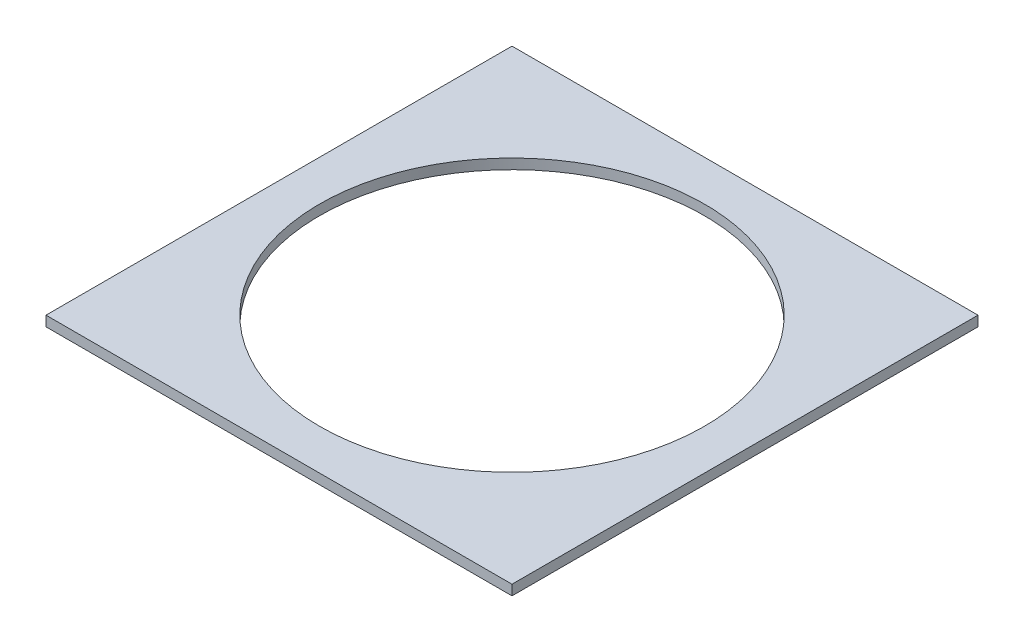
ISO-10303-21;
HEADER;
FILE_DESCRIPTION(('STEP AP214'),'2;1');
FILE_NAME('part.step','',(''),(''),'','','');
FILE_SCHEMA(('AUTOMOTIVE_DESIGN { 1 0 10303 214 1 1 1 1 }'));
ENDSEC;
DATA;
#1=APPLICATION_CONTEXT('core data for automotive mechanical design processes');
#2=APPLICATION_PROTOCOL_DEFINITION('international standard','automotive_design',2000,#1);
#3=PRODUCT_CONTEXT('',#1,'mechanical');
#4=PRODUCT('Part','Part','',(#3));
#5=PRODUCT_RELATED_PRODUCT_CATEGORY('part','',(#4));
#6=PRODUCT_DEFINITION_FORMATION('','',#4);
#7=PRODUCT_DEFINITION_CONTEXT('part definition',#1,'design');
#8=PRODUCT_DEFINITION('design','',#6,#7);
#9=PRODUCT_DEFINITION_SHAPE('','',#8);
#10=(LENGTH_UNIT() NAMED_UNIT(*) SI_UNIT(.MILLI.,.METRE.));
#11=(NAMED_UNIT(*) PLANE_ANGLE_UNIT() SI_UNIT($,.RADIAN.));
#12=(NAMED_UNIT(*) SI_UNIT($,.STERADIAN.) SOLID_ANGLE_UNIT());
#13=UNCERTAINTY_MEASURE_WITH_UNIT(LENGTH_MEASURE(1.E-05),#10,'distance_accuracy_value','');
#14=(GEOMETRIC_REPRESENTATION_CONTEXT(3) GLOBAL_UNCERTAINTY_ASSIGNED_CONTEXT((#13)) GLOBAL_UNIT_ASSIGNED_CONTEXT((#10,
#11,#12)) REPRESENTATION_CONTEXT('',''));
#15=CARTESIAN_POINT('',(0.,0.,0.));
#16=DIRECTION('',(0.,0.,1.));
#17=DIRECTION('',(1.,0.,0.));
#18=AXIS2_PLACEMENT_3D('',#15,#16,#17);
#19=CARTESIAN_POINT('',(-146.05,6.35,-146.05));
#20=DIRECTION('',(1.,0.,0.));
#21=DIRECTION('',(0.,0.,-1.));
#22=AXIS2_PLACEMENT_3D('',#19,#20,#21);
#23=PLANE('',#22);
#24=DIRECTION('',(0.,0.,1.));
#25=VECTOR('',#24,1.);
#26=CARTESIAN_POINT('',(-146.05,0.,-146.05));
#27=LINE('',#26,#25);
#28=CARTESIAN_POINT('',(-146.05,0.,-146.05));
#29=VERTEX_POINT('',#28);
#30=CARTESIAN_POINT('',(-146.05,0.,146.05));
#31=VERTEX_POINT('',#30);
#32=EDGE_CURVE('E111',#29,#31,#27,.T.);
#33=ORIENTED_EDGE('',*,*,#32,.T.);
#34=DIRECTION('',(0.,-1.,0.));
#35=VECTOR('',#34,1.);
#36=CARTESIAN_POINT('',(-146.05,6.35,146.05));
#37=LINE('',#36,#35);
#38=CARTESIAN_POINT('',(-146.05,6.35,146.05));
#39=VERTEX_POINT('',#38);
#40=EDGE_CURVE('E11',#39,#31,#37,.T.);
#41=ORIENTED_EDGE('',*,*,#40,.F.);
#42=DIRECTION('',(0.,0.,1.));
#43=VECTOR('',#42,1.);
#44=CARTESIAN_POINT('',(-146.05,6.35,-146.05));
#45=LINE('',#44,#43);
#46=CARTESIAN_POINT('',(-146.05,6.35,-146.05));
#47=VERTEX_POINT('',#46);
#48=EDGE_CURVE('E95',#47,#39,#45,.T.);
#49=ORIENTED_EDGE('',*,*,#48,.F.);
#50=DIRECTION('',(0.,-1.,0.));
#51=VECTOR('',#50,1.);
#52=CARTESIAN_POINT('',(-146.05,6.35,-146.05));
#53=LINE('',#52,#51);
#54=EDGE_CURVE('E107',#47,#29,#53,.T.);
#55=ORIENTED_EDGE('',*,*,#54,.T.);
#56=EDGE_LOOP('',(#33,#41,#49,#55));
#57=FACE_BOUND('',#56,.T.);
#58=ADVANCED_FACE('F43',(#57),#23,.F.);
#59=CARTESIAN_POINT('',(-146.05,6.35,146.05));
#60=DIRECTION('',(0.,0.,-1.));
#61=DIRECTION('',(-1.,0.,0.));
#62=AXIS2_PLACEMENT_3D('',#59,#60,#61);
#63=PLANE('',#62);
#64=DIRECTION('',(1.,0.,0.));
#65=VECTOR('',#64,1.);
#66=CARTESIAN_POINT('',(-146.05,0.,146.05));
#67=LINE('',#66,#65);
#68=CARTESIAN_POINT('',(146.05,0.,146.05));
#69=VERTEX_POINT('',#68);
#70=EDGE_CURVE('E100',#31,#69,#67,.T.);
#71=ORIENTED_EDGE('',*,*,#70,.T.);
#72=DIRECTION('',(0.,-1.,0.));
#73=VECTOR('',#72,1.);
#74=CARTESIAN_POINT('',(146.05,6.35,146.05));
#75=LINE('',#74,#73);
#76=CARTESIAN_POINT('',(146.05,6.35,146.05));
#77=VERTEX_POINT('',#76);
#78=EDGE_CURVE('E52',#77,#69,#75,.T.);
#79=ORIENTED_EDGE('',*,*,#78,.F.);
#80=DIRECTION('',(1.,0.,0.));
#81=VECTOR('',#80,1.);
#82=CARTESIAN_POINT('',(-146.05,6.35,146.05));
#83=LINE('',#82,#81);
#84=EDGE_CURVE('E90',#39,#77,#83,.T.);
#85=ORIENTED_EDGE('',*,*,#84,.F.);
#86=ORIENTED_EDGE('',*,*,#40,.T.);
#87=EDGE_LOOP('',(#71,#79,#85,#86));
#88=FACE_BOUND('',#87,.T.);
#89=ADVANCED_FACE('F99',(#88),#63,.F.);
#90=CARTESIAN_POINT('',(146.05,6.35,-146.05));
#91=DIRECTION('',(-1.,0.,0.));
#92=DIRECTION('',(0.,0.,1.));
#93=AXIS2_PLACEMENT_3D('',#90,#91,#92);
#94=PLANE('',#93);
#95=DIRECTION('',(0.,0.,-1.));
#96=VECTOR('',#95,1.);
#97=CARTESIAN_POINT('',(146.05,0.,-146.05));
#98=LINE('',#97,#96);
#99=CARTESIAN_POINT('',(146.05,0.,-146.05));
#100=VERTEX_POINT('',#99);
#101=EDGE_CURVE('E77',#69,#100,#98,.T.);
#102=ORIENTED_EDGE('',*,*,#101,.T.);
#103=DIRECTION('',(0.,-1.,0.));
#104=VECTOR('',#103,1.);
#105=CARTESIAN_POINT('',(146.05,6.35,-146.05));
#106=LINE('',#105,#104);
#107=CARTESIAN_POINT('',(146.05,6.35,-146.05));
#108=VERTEX_POINT('',#107);
#109=EDGE_CURVE('E102',#108,#100,#106,.T.);
#110=ORIENTED_EDGE('',*,*,#109,.F.);
#111=DIRECTION('',(0.,0.,-1.));
#112=VECTOR('',#111,1.);
#113=CARTESIAN_POINT('',(146.05,6.35,-146.05));
#114=LINE('',#113,#112);
#115=EDGE_CURVE('E93',#77,#108,#114,.T.);
#116=ORIENTED_EDGE('',*,*,#115,.F.);
#117=ORIENTED_EDGE('',*,*,#78,.T.);
#118=EDGE_LOOP('',(#102,#110,#116,#117));
#119=FACE_BOUND('',#118,.T.);
#120=ADVANCED_FACE('F103',(#119),#94,.F.);
#121=CARTESIAN_POINT('',(-146.05,6.35,-146.05));
#122=DIRECTION('',(0.,0.,1.));
#123=DIRECTION('',(1.,0.,0.));
#124=AXIS2_PLACEMENT_3D('',#121,#122,#123);
#125=PLANE('',#124);
#126=DIRECTION('',(-1.,0.,0.));
#127=VECTOR('',#126,1.);
#128=CARTESIAN_POINT('',(-146.05,0.,-146.05));
#129=LINE('',#128,#127);
#130=EDGE_CURVE('E83',#100,#29,#129,.T.);
#131=ORIENTED_EDGE('',*,*,#130,.T.);
#132=ORIENTED_EDGE('',*,*,#54,.F.);
#133=DIRECTION('',(-1.,0.,0.));
#134=VECTOR('',#133,1.);
#135=CARTESIAN_POINT('',(-146.05,6.35,-146.05));
#136=LINE('',#135,#134);
#137=EDGE_CURVE('E60',#108,#47,#136,.T.);
#138=ORIENTED_EDGE('',*,*,#137,.F.);
#139=ORIENTED_EDGE('',*,*,#109,.T.);
#140=EDGE_LOOP('',(#131,#132,#138,#139));
#141=FACE_BOUND('',#140,.T.);
#142=ADVANCED_FACE('F125',(#141),#125,.F.);
#143=CARTESIAN_POINT('',(0.,6.35,0.));
#144=DIRECTION('',(0.,1.,0.));
#145=DIRECTION('',(0.,0.,1.));
#146=AXIS2_PLACEMENT_3D('',#143,#144,#145);
#147=PLANE('',#146);
#148=CARTESIAN_POINT('',(0.,6.35,0.));
#149=DIRECTION('',(0.,1.,0.));
#150=DIRECTION('',(0.,0.,1.));
#151=AXIS2_PLACEMENT_3D('',#148,#149,#150);
#152=CIRCLE('',#151,120.65);
#153=CARTESIAN_POINT('',(0.,6.35,120.65));
#154=VERTEX_POINT('',#153);
#155=EDGE_CURVE('E132',#154,#154,#152,.T.);
#156=ORIENTED_EDGE('',*,*,#155,.F.);
#157=EDGE_LOOP('',(#156));
#158=FACE_BOUND('',#157,.T.);
#159=ORIENTED_EDGE('',*,*,#48,.T.);
#160=ORIENTED_EDGE('',*,*,#84,.T.);
#161=ORIENTED_EDGE('',*,*,#115,.T.);
#162=ORIENTED_EDGE('',*,*,#137,.T.);
#163=EDGE_LOOP('',(#159,#160,#161,#162));
#164=FACE_BOUND('',#163,.T.);
#165=ADVANCED_FACE('F91',(#158,#164),#147,.T.);
#166=CARTESIAN_POINT('',(0.,0.,0.));
#167=DIRECTION('',(0.,1.,0.));
#168=DIRECTION('',(0.,0.,1.));
#169=AXIS2_PLACEMENT_3D('',#166,#167,#168);
#170=PLANE('',#169);
#171=CARTESIAN_POINT('',(0.,0.,0.));
#172=DIRECTION('',(0.,1.,0.));
#173=DIRECTION('',(0.,0.,1.));
#174=AXIS2_PLACEMENT_3D('',#171,#172,#173);
#175=CIRCLE('',#174,120.65);
#176=CARTESIAN_POINT('',(0.,0.,120.65));
#177=VERTEX_POINT('',#176);
#178=EDGE_CURVE('E115',#177,#177,#175,.T.);
#179=ORIENTED_EDGE('',*,*,#178,.T.);
#180=EDGE_LOOP('',(#179));
#181=FACE_BOUND('',#180,.T.);
#182=ORIENTED_EDGE('',*,*,#32,.F.);
#183=ORIENTED_EDGE('',*,*,#130,.F.);
#184=ORIENTED_EDGE('',*,*,#101,.F.);
#185=ORIENTED_EDGE('',*,*,#70,.F.);
#186=EDGE_LOOP('',(#182,#183,#184,#185));
#187=FACE_BOUND('',#186,.T.);
#188=ADVANCED_FACE('F128',(#181,#187),#170,.F.);
#189=CARTESIAN_POINT('',(0.,0.,0.));
#190=DIRECTION('',(0.,1.,0.));
#191=DIRECTION('',(0.,0.,1.));
#192=AXIS2_PLACEMENT_3D('',#189,#190,#191);
#193=CYLINDRICAL_SURFACE('',#192,120.65);
#194=ORIENTED_EDGE('',*,*,#178,.F.);
#195=EDGE_LOOP('',(#194));
#196=FACE_BOUND('',#195,.T.);
#197=ORIENTED_EDGE('',*,*,#155,.T.);
#198=EDGE_LOOP('',(#197));
#199=FACE_BOUND('',#198,.T.);
#200=ADVANCED_FACE('F141',(#196,#199),#193,.F.);
#201=CLOSED_SHELL('',(#58,#89,#120,#142,#165,#188,#200));
#202=MANIFOLD_SOLID_BREP('B2',#201);
#203=ADVANCED_BREP_SHAPE_REPRESENTATION('',(#18,#202),#14);
#204=SHAPE_DEFINITION_REPRESENTATION(#9,#203);
ENDSEC;
END-ISO-10303-21;
